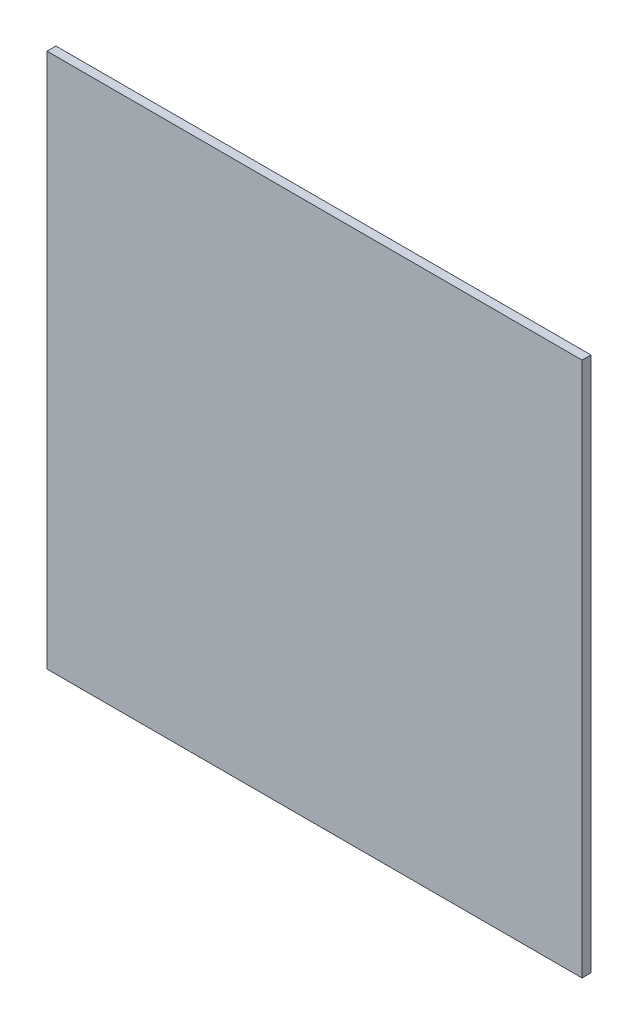
ISO-10303-21;
HEADER;
FILE_DESCRIPTION(('STEP AP214'),'2;1');
FILE_NAME('part.step','',(''),(''),'','','');
FILE_SCHEMA(('AUTOMOTIVE_DESIGN { 1 0 10303 214 1 1 1 1 }'));
ENDSEC;
DATA;
#1=APPLICATION_CONTEXT('core data for automotive mechanical design processes');
#2=APPLICATION_PROTOCOL_DEFINITION('international standard','automotive_design',2000,#1);
#3=PRODUCT_CONTEXT('',#1,'mechanical');
#4=PRODUCT('Part','Part','',(#3));
#5=PRODUCT_RELATED_PRODUCT_CATEGORY('part','',(#4));
#6=PRODUCT_DEFINITION_FORMATION('','',#4);
#7=PRODUCT_DEFINITION_CONTEXT('part definition',#1,'design');
#8=PRODUCT_DEFINITION('design','',#6,#7);
#9=PRODUCT_DEFINITION_SHAPE('','',#8);
#10=(LENGTH_UNIT() NAMED_UNIT(*) SI_UNIT(.MILLI.,.METRE.));
#11=(NAMED_UNIT(*) PLANE_ANGLE_UNIT() SI_UNIT($,.RADIAN.));
#12=(NAMED_UNIT(*) SI_UNIT($,.STERADIAN.) SOLID_ANGLE_UNIT());
#13=UNCERTAINTY_MEASURE_WITH_UNIT(LENGTH_MEASURE(1.E-05),#10,'distance_accuracy_value','');
#14=(GEOMETRIC_REPRESENTATION_CONTEXT(3) GLOBAL_UNCERTAINTY_ASSIGNED_CONTEXT((#13)) GLOBAL_UNIT_ASSIGNED_CONTEXT((#10,
#11,#12)) REPRESENTATION_CONTEXT('',''));
#15=CARTESIAN_POINT('',(0.,0.,0.));
#16=DIRECTION('',(0.,0.,1.));
#17=DIRECTION('',(1.,0.,0.));
#18=AXIS2_PLACEMENT_3D('',#15,#16,#17);
#19=CARTESIAN_POINT('',(-150.,-150.,5.));
#20=DIRECTION('',(1.,0.,0.));
#21=DIRECTION('',(0.,0.,-1.));
#22=AXIS2_PLACEMENT_3D('',#19,#20,#21);
#23=PLANE('',#22);
#24=DIRECTION('',(0.,-1.,0.));
#25=VECTOR('',#24,1.);
#26=CARTESIAN_POINT('',(-150.,-150.,0.));
#27=LINE('',#26,#25);
#28=CARTESIAN_POINT('',(-150.,150.,0.));
#29=VERTEX_POINT('',#28);
#30=CARTESIAN_POINT('',(-150.,-150.,0.));
#31=VERTEX_POINT('',#30);
#32=EDGE_CURVE('E107',#29,#31,#27,.T.);
#33=ORIENTED_EDGE('',*,*,#32,.T.);
#34=DIRECTION('',(0.,0.,-1.));
#35=VECTOR('',#34,1.);
#36=CARTESIAN_POINT('',(-150.,-150.,5.));
#37=LINE('',#36,#35);
#38=CARTESIAN_POINT('',(-150.,-150.,5.));
#39=VERTEX_POINT('',#38);
#40=EDGE_CURVE('E11',#39,#31,#37,.T.);
#41=ORIENTED_EDGE('',*,*,#40,.F.);
#42=DIRECTION('',(0.,-1.,0.));
#43=VECTOR('',#42,1.);
#44=CARTESIAN_POINT('',(-150.,-150.,5.));
#45=LINE('',#44,#43);
#46=CARTESIAN_POINT('',(-150.,150.,5.));
#47=VERTEX_POINT('',#46);
#48=EDGE_CURVE('E91',#47,#39,#45,.T.);
#49=ORIENTED_EDGE('',*,*,#48,.F.);
#50=DIRECTION('',(0.,0.,-1.));
#51=VECTOR('',#50,1.);
#52=CARTESIAN_POINT('',(-150.,150.,5.));
#53=LINE('',#52,#51);
#54=EDGE_CURVE('E103',#47,#29,#53,.T.);
#55=ORIENTED_EDGE('',*,*,#54,.T.);
#56=EDGE_LOOP('',(#33,#41,#49,#55));
#57=FACE_BOUND('',#56,.T.);
#58=ADVANCED_FACE('F39',(#57),#23,.F.);
#59=CARTESIAN_POINT('',(150.,-150.,5.));
#60=DIRECTION('',(0.,1.,0.));
#61=DIRECTION('',(-1.,0.,0.));
#62=AXIS2_PLACEMENT_3D('',#59,#60,#61);
#63=PLANE('',#62);
#64=DIRECTION('',(1.,0.,0.));
#65=VECTOR('',#64,1.);
#66=CARTESIAN_POINT('',(150.,-150.,0.));
#67=LINE('',#66,#65);
#68=CARTESIAN_POINT('',(150.,-150.,0.));
#69=VERTEX_POINT('',#68);
#70=EDGE_CURVE('E96',#31,#69,#67,.T.);
#71=ORIENTED_EDGE('',*,*,#70,.T.);
#72=DIRECTION('',(0.,0.,-1.));
#73=VECTOR('',#72,1.);
#74=CARTESIAN_POINT('',(150.,-150.,5.));
#75=LINE('',#74,#73);
#76=CARTESIAN_POINT('',(150.,-150.,5.));
#77=VERTEX_POINT('',#76);
#78=EDGE_CURVE('E48',#77,#69,#75,.T.);
#79=ORIENTED_EDGE('',*,*,#78,.F.);
#80=DIRECTION('',(1.,0.,0.));
#81=VECTOR('',#80,1.);
#82=CARTESIAN_POINT('',(150.,-150.,5.));
#83=LINE('',#82,#81);
#84=EDGE_CURVE('E86',#39,#77,#83,.T.);
#85=ORIENTED_EDGE('',*,*,#84,.F.);
#86=ORIENTED_EDGE('',*,*,#40,.T.);
#87=EDGE_LOOP('',(#71,#79,#85,#86));
#88=FACE_BOUND('',#87,.T.);
#89=ADVANCED_FACE('F95',(#88),#63,.F.);
#90=CARTESIAN_POINT('',(150.,-150.,5.));
#91=DIRECTION('',(-1.,0.,0.));
#92=DIRECTION('',(0.,0.,1.));
#93=AXIS2_PLACEMENT_3D('',#90,#91,#92);
#94=PLANE('',#93);
#95=DIRECTION('',(0.,1.,0.));
#96=VECTOR('',#95,1.);
#97=CARTESIAN_POINT('',(150.,-150.,0.));
#98=LINE('',#97,#96);
#99=CARTESIAN_POINT('',(150.,150.,0.));
#100=VERTEX_POINT('',#99);
#101=EDGE_CURVE('E73',#69,#100,#98,.T.);
#102=ORIENTED_EDGE('',*,*,#101,.T.);
#103=DIRECTION('',(0.,0.,-1.));
#104=VECTOR('',#103,1.);
#105=CARTESIAN_POINT('',(150.,150.,5.));
#106=LINE('',#105,#104);
#107=CARTESIAN_POINT('',(150.,150.,5.));
#108=VERTEX_POINT('',#107);
#109=EDGE_CURVE('E98',#108,#100,#106,.T.);
#110=ORIENTED_EDGE('',*,*,#109,.F.);
#111=DIRECTION('',(0.,1.,0.));
#112=VECTOR('',#111,1.);
#113=CARTESIAN_POINT('',(150.,-150.,5.));
#114=LINE('',#113,#112);
#115=EDGE_CURVE('E89',#77,#108,#114,.T.);
#116=ORIENTED_EDGE('',*,*,#115,.F.);
#117=ORIENTED_EDGE('',*,*,#78,.T.);
#118=EDGE_LOOP('',(#102,#110,#116,#117));
#119=FACE_BOUND('',#118,.T.);
#120=ADVANCED_FACE('F99',(#119),#94,.F.);
#121=CARTESIAN_POINT('',(150.,150.,5.));
#122=DIRECTION('',(0.,-1.,0.));
#123=DIRECTION('',(1.,0.,0.));
#124=AXIS2_PLACEMENT_3D('',#121,#122,#123);
#125=PLANE('',#124);
#126=DIRECTION('',(-1.,0.,0.));
#127=VECTOR('',#126,1.);
#128=CARTESIAN_POINT('',(150.,150.,0.));
#129=LINE('',#128,#127);
#130=EDGE_CURVE('E79',#100,#29,#129,.T.);
#131=ORIENTED_EDGE('',*,*,#130,.T.);
#132=ORIENTED_EDGE('',*,*,#54,.F.);
#133=DIRECTION('',(-1.,0.,0.));
#134=VECTOR('',#133,1.);
#135=CARTESIAN_POINT('',(150.,150.,5.));
#136=LINE('',#135,#134);
#137=EDGE_CURVE('E56',#108,#47,#136,.T.);
#138=ORIENTED_EDGE('',*,*,#137,.F.);
#139=ORIENTED_EDGE('',*,*,#109,.T.);
#140=EDGE_LOOP('',(#131,#132,#138,#139));
#141=FACE_BOUND('',#140,.T.);
#142=ADVANCED_FACE('F120',(#141),#125,.F.);
#143=CARTESIAN_POINT('',(0.,0.,5.));
#144=DIRECTION('',(0.,0.,1.));
#145=DIRECTION('',(1.,0.,0.));
#146=AXIS2_PLACEMENT_3D('',#143,#144,#145);
#147=PLANE('',#146);
#148=ORIENTED_EDGE('',*,*,#48,.T.);
#149=ORIENTED_EDGE('',*,*,#84,.T.);
#150=ORIENTED_EDGE('',*,*,#115,.T.);
#151=ORIENTED_EDGE('',*,*,#137,.T.);
#152=EDGE_LOOP('',(#148,#149,#150,#151));
#153=FACE_BOUND('',#152,.T.);
#154=ADVANCED_FACE('F87',(#153),#147,.T.);
#155=CARTESIAN_POINT('',(0.,0.,0.));
#156=DIRECTION('',(0.,0.,1.));
#157=DIRECTION('',(1.,0.,0.));
#158=AXIS2_PLACEMENT_3D('',#155,#156,#157);
#159=PLANE('',#158);
#160=ORIENTED_EDGE('',*,*,#32,.F.);
#161=ORIENTED_EDGE('',*,*,#130,.F.);
#162=ORIENTED_EDGE('',*,*,#101,.F.);
#163=ORIENTED_EDGE('',*,*,#70,.F.);
#164=EDGE_LOOP('',(#160,#161,#162,#163));
#165=FACE_BOUND('',#164,.T.);
#166=ADVANCED_FACE('F123',(#165),#159,.F.);
#167=CLOSED_SHELL('',(#58,#89,#120,#142,#154,#166));
#168=MANIFOLD_SOLID_BREP('B2',#167);
#169=ADVANCED_BREP_SHAPE_REPRESENTATION('',(#18,#168),#14);
#170=SHAPE_DEFINITION_REPRESENTATION(#9,#169);
ENDSEC;
END-ISO-10303-21;
